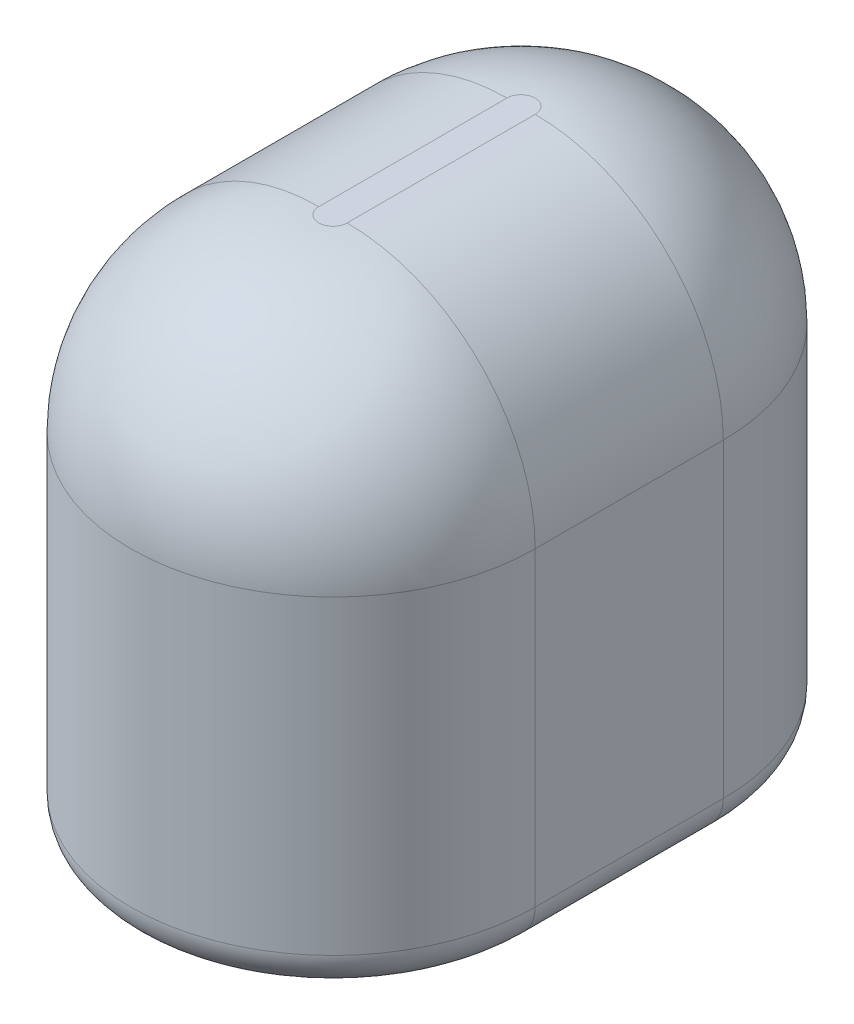
ISO-10303-21;
HEADER;
FILE_DESCRIPTION(('STEP AP214'),'2;1');
FILE_NAME('part.step','',(''),(''),'','','');
FILE_SCHEMA(('AUTOMOTIVE_DESIGN { 1 0 10303 214 1 1 1 1 }'));
ENDSEC;
DATA;
#1=APPLICATION_CONTEXT('core data for automotive mechanical design processes');
#2=APPLICATION_PROTOCOL_DEFINITION('international standard','automotive_design',2000,#1);
#3=PRODUCT_CONTEXT('',#1,'mechanical');
#4=PRODUCT('Part','Part','',(#3));
#5=PRODUCT_RELATED_PRODUCT_CATEGORY('part','',(#4));
#6=PRODUCT_DEFINITION_FORMATION('','',#4);
#7=PRODUCT_DEFINITION_CONTEXT('part definition',#1,'design');
#8=PRODUCT_DEFINITION('design','',#6,#7);
#9=PRODUCT_DEFINITION_SHAPE('','',#8);
#10=(LENGTH_UNIT() NAMED_UNIT(*) SI_UNIT(.MILLI.,.METRE.));
#11=(NAMED_UNIT(*) PLANE_ANGLE_UNIT() SI_UNIT($,.RADIAN.));
#12=(NAMED_UNIT(*) SI_UNIT($,.STERADIAN.) SOLID_ANGLE_UNIT());
#13=UNCERTAINTY_MEASURE_WITH_UNIT(LENGTH_MEASURE(1.E-05),#10,'distance_accuracy_value','');
#14=(GEOMETRIC_REPRESENTATION_CONTEXT(3) GLOBAL_UNCERTAINTY_ASSIGNED_CONTEXT((#13)) GLOBAL_UNIT_ASSIGNED_CONTEXT((#10,
#11,#12)) REPRESENTATION_CONTEXT('',''));
#15=CARTESIAN_POINT('',(0.,0.,0.));
#16=DIRECTION('',(0.,0.,1.));
#17=DIRECTION('',(1.,0.,0.));
#18=AXIS2_PLACEMENT_3D('',#15,#16,#17);
#19=CARTESIAN_POINT('',(0.,28.5,5.));
#20=DIRECTION('',(0.,-1.,0.));
#21=DIRECTION('',(0.,0.,-1.));
#22=AXIS2_PLACEMENT_3D('',#19,#20,#21);
#23=CYLINDRICAL_SURFACE('',#22,10.75);
#24=DIRECTION('',(0.,-1.,0.));
#25=VECTOR('',#24,1.);
#26=CARTESIAN_POINT('',(-10.75,28.5,5.));
#27=LINE('',#26,#25);
#28=CARTESIAN_POINT('',(-10.75,18.5,5.));
#29=VERTEX_POINT('',#28);
#30=CARTESIAN_POINT('',(-10.75,2.00000000000001,5.));
#31=VERTEX_POINT('',#30);
#32=EDGE_CURVE('E209',#29,#31,#27,.T.);
#33=ORIENTED_EDGE('',*,*,#32,.T.);
#34=CARTESIAN_POINT('',(0.,2.,5.));
#35=DIRECTION('',(0.,1.,0.));
#36=DIRECTION('',(0.,0.,1.));
#37=AXIS2_PLACEMENT_3D('',#34,#35,#36);
#38=CIRCLE('',#37,10.75);
#39=CARTESIAN_POINT('',(10.75,2.00000000000001,5.));
#40=VERTEX_POINT('',#39);
#41=EDGE_CURVE('E112',#31,#40,#38,.T.);
#42=ORIENTED_EDGE('',*,*,#41,.T.);
#43=DIRECTION('',(0.,-1.,0.));
#44=VECTOR('',#43,1.);
#45=CARTESIAN_POINT('',(10.75,28.5,5.));
#46=LINE('',#45,#44);
#47=CARTESIAN_POINT('',(10.75,18.5,5.));
#48=VERTEX_POINT('',#47);
#49=EDGE_CURVE('E186',#48,#40,#46,.T.);
#50=ORIENTED_EDGE('',*,*,#49,.F.);
#51=CARTESIAN_POINT('',(0.,18.5,5.));
#52=DIRECTION('',(0.,1.,0.));
#53=DIRECTION('',(0.,0.,1.));
#54=AXIS2_PLACEMENT_3D('',#51,#52,#53);
#55=CIRCLE('',#54,10.75);
#56=EDGE_CURVE('E201',#48,#29,#55,.F.);
#57=ORIENTED_EDGE('',*,*,#56,.T.);
#58=EDGE_LOOP('',(#33,#42,#50,#57));
#59=FACE_BOUND('',#58,.T.);
#60=ADVANCED_FACE('F34',(#59),#23,.T.);
#61=CARTESIAN_POINT('',(10.75,28.5,5.));
#62=DIRECTION('',(-1.,0.,0.));
#63=DIRECTION('',(0.,0.,1.));
#64=AXIS2_PLACEMENT_3D('',#61,#62,#63);
#65=PLANE('',#64);
#66=ORIENTED_EDGE('',*,*,#49,.T.);
#67=DIRECTION('',(0.,0.,-1.));
#68=VECTOR('',#67,1.);
#69=CARTESIAN_POINT('',(10.75,2.,5.));
#70=LINE('',#69,#68);
#71=CARTESIAN_POINT('',(10.75,2.00000000000001,-5.00000000000001));
#72=VERTEX_POINT('',#71);
#73=EDGE_CURVE('E119',#40,#72,#70,.T.);
#74=ORIENTED_EDGE('',*,*,#73,.T.);
#75=DIRECTION('',(0.,-1.,0.));
#76=VECTOR('',#75,1.);
#77=CARTESIAN_POINT('',(10.75,28.5,-5.00000000000001));
#78=LINE('',#77,#76);
#79=CARTESIAN_POINT('',(10.75,18.5,-5.00000000000001));
#80=VERTEX_POINT('',#79);
#81=EDGE_CURVE('E672',#80,#72,#78,.T.);
#82=ORIENTED_EDGE('',*,*,#81,.F.);
#83=DIRECTION('',(0.,0.,-1.));
#84=VECTOR('',#83,1.);
#85=CARTESIAN_POINT('',(10.75,18.5,5.));
#86=LINE('',#85,#84);
#87=EDGE_CURVE('E199',#80,#48,#86,.F.);
#88=ORIENTED_EDGE('',*,*,#87,.T.);
#89=EDGE_LOOP('',(#66,#74,#82,#88));
#90=FACE_BOUND('',#89,.T.);
#91=ADVANCED_FACE('F634',(#90),#65,.F.);
#92=CARTESIAN_POINT('',(0.,28.5,-5.));
#93=DIRECTION('',(0.,-1.,0.));
#94=DIRECTION('',(0.,0.,-1.));
#95=AXIS2_PLACEMENT_3D('',#92,#93,#94);
#96=CYLINDRICAL_SURFACE('',#95,10.75);
#97=ORIENTED_EDGE('',*,*,#81,.T.);
#98=CARTESIAN_POINT('',(0.,2.,-5.));
#99=DIRECTION('',(0.,1.,0.));
#100=DIRECTION('',(0.,0.,1.));
#101=AXIS2_PLACEMENT_3D('',#98,#99,#100);
#102=CIRCLE('',#101,10.75);
#103=CARTESIAN_POINT('',(-10.75,2.00000000000001,-5.));
#104=VERTEX_POINT('',#103);
#105=EDGE_CURVE('E221',#72,#104,#102,.T.);
#106=ORIENTED_EDGE('',*,*,#105,.T.);
#107=DIRECTION('',(0.,-1.,0.));
#108=VECTOR('',#107,1.);
#109=CARTESIAN_POINT('',(-10.75,28.5,-5.));
#110=LINE('',#109,#108);
#111=CARTESIAN_POINT('',(-10.75,18.5,-5.));
#112=VERTEX_POINT('',#111);
#113=EDGE_CURVE('E669',#112,#104,#110,.T.);
#114=ORIENTED_EDGE('',*,*,#113,.F.);
#115=CARTESIAN_POINT('',(0.,18.5,-5.));
#116=DIRECTION('',(0.,1.,0.));
#117=DIRECTION('',(0.,0.,1.));
#118=AXIS2_PLACEMENT_3D('',#115,#116,#117);
#119=CIRCLE('',#118,10.75);
#120=EDGE_CURVE('E193',#112,#80,#119,.F.);
#121=ORIENTED_EDGE('',*,*,#120,.T.);
#122=EDGE_LOOP('',(#97,#106,#114,#121));
#123=FACE_BOUND('',#122,.T.);
#124=ADVANCED_FACE('F625',(#123),#96,.T.);
#125=CARTESIAN_POINT('',(-10.75,28.5,5.));
#126=DIRECTION('',(1.,0.,0.));
#127=DIRECTION('',(0.,0.,-1.));
#128=AXIS2_PLACEMENT_3D('',#125,#126,#127);
#129=PLANE('',#128);
#130=ORIENTED_EDGE('',*,*,#113,.T.);
#131=DIRECTION('',(0.,0.,1.));
#132=VECTOR('',#131,1.);
#133=CARTESIAN_POINT('',(-10.75,2.,5.));
#134=LINE('',#133,#132);
#135=EDGE_CURVE('E202',#104,#31,#134,.T.);
#136=ORIENTED_EDGE('',*,*,#135,.T.);
#137=ORIENTED_EDGE('',*,*,#32,.F.);
#138=DIRECTION('',(0.,0.,1.));
#139=VECTOR('',#138,1.);
#140=CARTESIAN_POINT('',(-10.75,18.5,-5.));
#141=LINE('',#140,#139);
#142=EDGE_CURVE('E172',#29,#112,#141,.F.);
#143=ORIENTED_EDGE('',*,*,#142,.T.);
#144=EDGE_LOOP('',(#130,#136,#137,#143));
#145=FACE_BOUND('',#144,.T.);
#146=ADVANCED_FACE('F618',(#145),#129,.F.);
#147=CARTESIAN_POINT('',(0.,28.5,5.));
#148=DIRECTION('',(0.,1.,0.));
#149=DIRECTION('',(0.,0.,1.));
#150=AXIS2_PLACEMENT_3D('',#147,#148,#149);
#151=PLANE('',#150);
#152=CARTESIAN_POINT('',(0.,28.5,-5.));
#153=DIRECTION('',(0.,1.,0.));
#154=DIRECTION('',(0.,0.,1.));
#155=AXIS2_PLACEMENT_3D('',#152,#153,#154);
#156=CIRCLE('',#155,0.749999999999997);
#157=CARTESIAN_POINT('',(0.749999999999997,28.5,-5.));
#158=VERTEX_POINT('',#157);
#159=CARTESIAN_POINT('',(-0.749999999999998,28.5,-5.));
#160=VERTEX_POINT('',#159);
#161=EDGE_CURVE('E190',#158,#160,#156,.T.);
#162=ORIENTED_EDGE('',*,*,#161,.T.);
#163=DIRECTION('',(0.,0.,1.));
#164=VECTOR('',#163,1.);
#165=CARTESIAN_POINT('',(-0.749999999999999,28.5,5.));
#166=LINE('',#165,#164);
#167=CARTESIAN_POINT('',(-0.749999999999996,28.5,5.));
#168=VERTEX_POINT('',#167);
#169=EDGE_CURVE('E170',#160,#168,#166,.T.);
#170=ORIENTED_EDGE('',*,*,#169,.T.);
#171=CARTESIAN_POINT('',(0.,28.5,5.));
#172=DIRECTION('',(0.,1.,0.));
#173=DIRECTION('',(0.,0.,1.));
#174=AXIS2_PLACEMENT_3D('',#171,#172,#173);
#175=CIRCLE('',#174,0.749999999999997);
#176=CARTESIAN_POINT('',(0.749999999999998,28.5,5.));
#177=VERTEX_POINT('',#176);
#178=EDGE_CURVE('E179',#168,#177,#175,.T.);
#179=ORIENTED_EDGE('',*,*,#178,.T.);
#180=DIRECTION('',(0.,0.,-1.));
#181=VECTOR('',#180,1.);
#182=CARTESIAN_POINT('',(0.749999999999997,28.5,-5.));
#183=LINE('',#182,#181);
#184=EDGE_CURVE('E185',#177,#158,#183,.T.);
#185=ORIENTED_EDGE('',*,*,#184,.T.);
#186=EDGE_LOOP('',(#162,#170,#179,#185));
#187=FACE_BOUND('',#186,.T.);
#188=ADVANCED_FACE('F188',(#187),#151,.T.);
#189=CARTESIAN_POINT('',(0.,0.,5.));
#190=DIRECTION('',(0.,1.,0.));
#191=DIRECTION('',(0.,0.,1.));
#192=AXIS2_PLACEMENT_3D('',#189,#190,#191);
#193=PLANE('',#192);
#194=CARTESIAN_POINT('',(0.,0.,0.));
#195=DIRECTION('',(0.,1.,0.));
#196=DIRECTION('',(0.,0.,1.));
#197=AXIS2_PLACEMENT_3D('',#194,#195,#196);
#198=CIRCLE('',#197,2.25);
#199=CARTESIAN_POINT('',(0.,0.,2.25));
#200=VERTEX_POINT('',#199);
#201=EDGE_CURVE('E243',#200,#200,#198,.T.);
#202=ORIENTED_EDGE('',*,*,#201,.T.);
#203=EDGE_LOOP('',(#202));
#204=FACE_BOUND('',#203,.T.);
#205=CARTESIAN_POINT('',(0.,0.,5.));
#206=DIRECTION('',(0.,1.,0.));
#207=DIRECTION('',(0.,0.,1.));
#208=AXIS2_PLACEMENT_3D('',#205,#206,#207);
#209=CIRCLE('',#208,8.75);
#210=CARTESIAN_POINT('',(8.75,0.,5.));
#211=VERTEX_POINT('',#210);
#212=CARTESIAN_POINT('',(-8.75,0.,5.));
#213=VERTEX_POINT('',#212);
#214=EDGE_CURVE('E212',#211,#213,#209,.F.);
#215=ORIENTED_EDGE('',*,*,#214,.T.);
#216=DIRECTION('',(0.,0.,1.));
#217=VECTOR('',#216,1.);
#218=CARTESIAN_POINT('',(-8.75,0.,5.));
#219=LINE('',#218,#217);
#220=CARTESIAN_POINT('',(-8.75,0.,-5.));
#221=VERTEX_POINT('',#220);
#222=EDGE_CURVE('E218',#213,#221,#219,.F.);
#223=ORIENTED_EDGE('',*,*,#222,.T.);
#224=CARTESIAN_POINT('',(0.,0.,-5.));
#225=DIRECTION('',(0.,1.,0.));
#226=DIRECTION('',(0.,0.,1.));
#227=AXIS2_PLACEMENT_3D('',#224,#225,#226);
#228=CIRCLE('',#227,8.75);
#229=CARTESIAN_POINT('',(8.75,0.,-5.));
#230=VERTEX_POINT('',#229);
#231=EDGE_CURVE('E216',#221,#230,#228,.F.);
#232=ORIENTED_EDGE('',*,*,#231,.T.);
#233=DIRECTION('',(0.,0.,-1.));
#234=VECTOR('',#233,1.);
#235=CARTESIAN_POINT('',(8.75,0.,5.));
#236=LINE('',#235,#234);
#237=EDGE_CURVE('E214',#230,#211,#236,.F.);
#238=ORIENTED_EDGE('',*,*,#237,.T.);
#239=EDGE_LOOP('',(#215,#223,#232,#238));
#240=FACE_BOUND('',#239,.T.);
#241=ADVANCED_FACE('F602',(#204,#240),#193,.F.);
#242=CARTESIAN_POINT('',(0.749999999999999,18.5,5.));
#243=DIRECTION('',(0.,0.,1.));
#244=DIRECTION('',(1.,0.,0.));
#245=AXIS2_PLACEMENT_3D('',#242,#243,#244);
#246=CYLINDRICAL_SURFACE('',#245,10.);
#247=CARTESIAN_POINT('',(0.749999999999997,18.5,5.));
#248=DIRECTION('',(0.,0.,1.));
#249=DIRECTION('',(1.,0.,0.));
#250=AXIS2_PLACEMENT_3D('',#247,#248,#249);
#251=CIRCLE('',#250,10.);
#252=EDGE_CURVE('E182',#48,#177,#251,.T.);
#253=ORIENTED_EDGE('',*,*,#252,.F.);
#254=ORIENTED_EDGE('',*,*,#87,.F.);
#255=CARTESIAN_POINT('',(0.749999999999997,18.5,-5.));
#256=DIRECTION('',(0.,0.,-1.));
#257=DIRECTION('',(-1.,0.,0.));
#258=AXIS2_PLACEMENT_3D('',#255,#256,#257);
#259=CIRCLE('',#258,10.);
#260=EDGE_CURVE('E206',#158,#80,#259,.T.);
#261=ORIENTED_EDGE('',*,*,#260,.F.);
#262=ORIENTED_EDGE('',*,*,#184,.F.);
#263=EDGE_LOOP('',(#253,#254,#261,#262));
#264=FACE_BOUND('',#263,.T.);
#265=ADVANCED_FACE('F593',(#264),#246,.T.);
#266=CARTESIAN_POINT('',(0.,18.5,-5.));
#267=DIRECTION('',(0.,1.,0.));
#268=DIRECTION('',(0.,0.,1.));
#269=AXIS2_PLACEMENT_3D('',#266,#267,#268);
#270=DEGENERATE_TOROIDAL_SURFACE('',#269,0.749999999999997,10.,.T.);
#271=ORIENTED_EDGE('',*,*,#260,.T.);
#272=ORIENTED_EDGE('',*,*,#120,.F.);
#273=CARTESIAN_POINT('',(-0.749999999999998,18.5,-5.));
#274=DIRECTION('',(0.,0.,1.));
#275=DIRECTION('',(1.,0.,0.));
#276=AXIS2_PLACEMENT_3D('',#273,#274,#275);
#277=CIRCLE('',#276,10.);
#278=EDGE_CURVE('E175',#160,#112,#277,.T.);
#279=ORIENTED_EDGE('',*,*,#278,.F.);
#280=ORIENTED_EDGE('',*,*,#161,.F.);
#281=EDGE_LOOP('',(#271,#272,#279,#280));
#282=FACE_BOUND('',#281,.T.);
#283=ADVANCED_FACE('F585',(#282),#270,.T.);
#284=CARTESIAN_POINT('',(0.,18.5,5.));
#285=DIRECTION('',(0.,1.,0.));
#286=DIRECTION('',(0.,0.,1.));
#287=AXIS2_PLACEMENT_3D('',#284,#285,#286);
#288=DEGENERATE_TOROIDAL_SURFACE('',#287,0.749999999999997,10.,.T.);
#289=ORIENTED_EDGE('',*,*,#252,.T.);
#290=ORIENTED_EDGE('',*,*,#178,.F.);
#291=CARTESIAN_POINT('',(-0.749999999999995,18.5,5.));
#292=DIRECTION('',(0.,0.,-1.));
#293=DIRECTION('',(-1.,0.,0.));
#294=AXIS2_PLACEMENT_3D('',#291,#292,#293);
#295=CIRCLE('',#294,10.);
#296=EDGE_CURVE('E166',#29,#168,#295,.T.);
#297=ORIENTED_EDGE('',*,*,#296,.F.);
#298=ORIENTED_EDGE('',*,*,#56,.F.);
#299=EDGE_LOOP('',(#289,#290,#297,#298));
#300=FACE_BOUND('',#299,.T.);
#301=ADVANCED_FACE('F180',(#300),#288,.T.);
#302=CARTESIAN_POINT('',(-0.749999999999999,18.5,5.));
#303=DIRECTION('',(0.,0.,-1.));
#304=DIRECTION('',(-1.,0.,0.));
#305=AXIS2_PLACEMENT_3D('',#302,#303,#304);
#306=CYLINDRICAL_SURFACE('',#305,10.);
#307=ORIENTED_EDGE('',*,*,#278,.T.);
#308=ORIENTED_EDGE('',*,*,#142,.F.);
#309=ORIENTED_EDGE('',*,*,#296,.T.);
#310=ORIENTED_EDGE('',*,*,#169,.F.);
#311=EDGE_LOOP('',(#307,#308,#309,#310));
#312=FACE_BOUND('',#311,.T.);
#313=ADVANCED_FACE('F168',(#312),#306,.T.);
#314=CARTESIAN_POINT('',(8.75,2.,5.));
#315=DIRECTION('',(0.,0.,-1.));
#316=DIRECTION('',(-1.,0.,0.));
#317=AXIS2_PLACEMENT_3D('',#314,#315,#316);
#318=CYLINDRICAL_SURFACE('',#317,2.);
#319=CARTESIAN_POINT('',(8.75,2.,5.));
#320=DIRECTION('',(0.,0.,1.));
#321=DIRECTION('',(1.,0.,0.));
#322=AXIS2_PLACEMENT_3D('',#319,#320,#321);
#323=CIRCLE('',#322,2.);
#324=EDGE_CURVE('E230',#211,#40,#323,.T.);
#325=ORIENTED_EDGE('',*,*,#324,.F.);
#326=ORIENTED_EDGE('',*,*,#237,.F.);
#327=CARTESIAN_POINT('',(8.75,2.,-5.00000000000001));
#328=DIRECTION('',(0.,0.,-1.));
#329=DIRECTION('',(0.,1.,0.));
#330=AXIS2_PLACEMENT_3D('',#327,#328,#329);
#331=CIRCLE('',#330,2.);
#332=EDGE_CURVE('E176',#72,#230,#331,.T.);
#333=ORIENTED_EDGE('',*,*,#332,.F.);
#334=ORIENTED_EDGE('',*,*,#73,.F.);
#335=EDGE_LOOP('',(#325,#326,#333,#334));
#336=FACE_BOUND('',#335,.T.);
#337=ADVANCED_FACE('F559',(#336),#318,.T.);
#338=CARTESIAN_POINT('',(0.,2.,-5.));
#339=DIRECTION('',(0.,1.,0.));
#340=DIRECTION('',(0.,0.,1.));
#341=AXIS2_PLACEMENT_3D('',#338,#339,#340);
#342=TOROIDAL_SURFACE('',#341,8.75,2.);
#343=ORIENTED_EDGE('',*,*,#332,.T.);
#344=ORIENTED_EDGE('',*,*,#231,.F.);
#345=CARTESIAN_POINT('',(-8.75,2.,-5.));
#346=DIRECTION('',(0.,0.,1.));
#347=DIRECTION('',(1.,0.,0.));
#348=AXIS2_PLACEMENT_3D('',#345,#346,#347);
#349=CIRCLE('',#348,2.);
#350=EDGE_CURVE('E228',#104,#221,#349,.T.);
#351=ORIENTED_EDGE('',*,*,#350,.F.);
#352=ORIENTED_EDGE('',*,*,#105,.F.);
#353=EDGE_LOOP('',(#343,#344,#351,#352));
#354=FACE_BOUND('',#353,.T.);
#355=ADVANCED_FACE('F550',(#354),#342,.T.);
#356=CARTESIAN_POINT('',(0.,2.,5.));
#357=DIRECTION('',(0.,1.,0.));
#358=DIRECTION('',(0.,0.,1.));
#359=AXIS2_PLACEMENT_3D('',#356,#357,#358);
#360=TOROIDAL_SURFACE('',#359,8.75,2.);
#361=ORIENTED_EDGE('',*,*,#324,.T.);
#362=ORIENTED_EDGE('',*,*,#41,.F.);
#363=CARTESIAN_POINT('',(-8.75,2.,5.));
#364=DIRECTION('',(0.,0.,-1.));
#365=DIRECTION('',(-1.,0.,0.));
#366=AXIS2_PLACEMENT_3D('',#363,#364,#365);
#367=CIRCLE('',#366,2.);
#368=EDGE_CURVE('E226',#213,#31,#367,.T.);
#369=ORIENTED_EDGE('',*,*,#368,.F.);
#370=ORIENTED_EDGE('',*,*,#214,.F.);
#371=EDGE_LOOP('',(#361,#362,#369,#370));
#372=FACE_BOUND('',#371,.T.);
#373=ADVANCED_FACE('F541',(#372),#360,.T.);
#374=CARTESIAN_POINT('',(-8.75,2.,5.));
#375=DIRECTION('',(0.,0.,1.));
#376=DIRECTION('',(1.,0.,0.));
#377=AXIS2_PLACEMENT_3D('',#374,#375,#376);
#378=CYLINDRICAL_SURFACE('',#377,2.);
#379=ORIENTED_EDGE('',*,*,#350,.T.);
#380=ORIENTED_EDGE('',*,*,#222,.F.);
#381=ORIENTED_EDGE('',*,*,#368,.T.);
#382=ORIENTED_EDGE('',*,*,#135,.F.);
#383=EDGE_LOOP('',(#379,#380,#381,#382));
#384=FACE_BOUND('',#383,.T.);
#385=ADVANCED_FACE('F533',(#384),#378,.T.);
#386=CARTESIAN_POINT('',(0.,-7.,0.));
#387=DIRECTION('',(0.,1.,0.));
#388=DIRECTION('',(0.,0.,1.));
#389=AXIS2_PLACEMENT_3D('',#386,#387,#388);
#390=CYLINDRICAL_SURFACE('',#389,1.75);
#391=CARTESIAN_POINT('',(0.,-0.5,0.));
#392=DIRECTION('',(0.,1.,0.));
#393=DIRECTION('',(0.,0.,1.));
#394=AXIS2_PLACEMENT_3D('',#391,#392,#393);
#395=CIRCLE('',#394,1.75);
#396=CARTESIAN_POINT('',(0.,-0.5,1.75));
#397=VERTEX_POINT('',#396);
#398=EDGE_CURVE('E240',#397,#397,#395,.F.);
#399=ORIENTED_EDGE('',*,*,#398,.T.);
#400=EDGE_LOOP('',(#399));
#401=FACE_BOUND('',#400,.T.);
#402=CARTESIAN_POINT('',(0.,-6.,0.));
#403=DIRECTION('',(0.,-1.,0.));
#404=DIRECTION('',(0.,0.,-1.));
#405=AXIS2_PLACEMENT_3D('',#402,#403,#404);
#406=CIRCLE('',#405,1.75);
#407=CARTESIAN_POINT('',(0.,-6.,-1.75));
#408=VERTEX_POINT('',#407);
#409=EDGE_CURVE('E237',#408,#408,#406,.F.);
#410=ORIENTED_EDGE('',*,*,#409,.T.);
#411=EDGE_LOOP('',(#410));
#412=FACE_BOUND('',#411,.T.);
#413=ADVANCED_FACE('F524',(#401,#412),#390,.T.);
#414=CARTESIAN_POINT('',(0.,-7.,0.));
#415=DIRECTION('',(0.,-1.,0.));
#416=DIRECTION('',(0.,0.,-1.));
#417=AXIS2_PLACEMENT_3D('',#414,#415,#416);
#418=PLANE('',#417);
#419=CARTESIAN_POINT('',(0.,-7.,0.));
#420=DIRECTION('',(0.,-1.,0.));
#421=DIRECTION('',(0.,0.,-1.));
#422=AXIS2_PLACEMENT_3D('',#419,#420,#421);
#423=CIRCLE('',#422,0.75);
#424=CARTESIAN_POINT('',(0.,-7.,-0.75));
#425=VERTEX_POINT('',#424);
#426=EDGE_CURVE('E225',#425,#425,#423,.T.);
#427=ORIENTED_EDGE('',*,*,#426,.T.);
#428=EDGE_LOOP('',(#427));
#429=FACE_BOUND('',#428,.T.);
#430=ADVANCED_FACE('F515',(#429),#418,.T.);
#431=CARTESIAN_POINT('',(0.,-6.,0.));
#432=DIRECTION('',(0.,-1.,0.));
#433=DIRECTION('',(0.,0.,-1.));
#434=AXIS2_PLACEMENT_3D('',#431,#432,#433);
#435=DEGENERATE_TOROIDAL_SURFACE('',#434,0.75,1.,.T.);
#436=ORIENTED_EDGE('',*,*,#409,.F.);
#437=EDGE_LOOP('',(#436));
#438=FACE_BOUND('',#437,.T.);
#439=ORIENTED_EDGE('',*,*,#426,.F.);
#440=EDGE_LOOP('',(#439));
#441=FACE_BOUND('',#440,.T.);
#442=ADVANCED_FACE('F506',(#438,#441),#435,.T.);
#443=CARTESIAN_POINT('',(0.,-0.5,0.));
#444=DIRECTION('',(0.,1.,0.));
#445=DIRECTION('',(0.,0.,1.));
#446=AXIS2_PLACEMENT_3D('',#443,#444,#445);
#447=TOROIDAL_SURFACE('',#446,2.25,0.5);
#448=ORIENTED_EDGE('',*,*,#201,.F.);
#449=EDGE_LOOP('',(#448));
#450=FACE_BOUND('',#449,.T.);
#451=ORIENTED_EDGE('',*,*,#398,.F.);
#452=EDGE_LOOP('',(#451));
#453=FACE_BOUND('',#452,.T.);
#454=ADVANCED_FACE('F376',(#450,#453),#447,.F.);
#455=CLOSED_SHELL('',(#60,#91,#124,#146,#188,#241,#265,#283,#301,#313,#337,#355,#373,#385,#413,
#430,#442,#454));
#456=CARTESIAN_POINT('',(0.,28.5,5.));
#457=DIRECTION('',(0.,-1.,0.));
#458=DIRECTION('',(0.,0.,-1.));
#459=AXIS2_PLACEMENT_3D('',#456,#457,#458);
#460=CYLINDRICAL_SURFACE('',#459,9.75);
#461=DIRECTION('',(0.,-1.,0.));
#462=VECTOR('',#461,1.);
#463=CARTESIAN_POINT('',(-9.74999999999999,28.5,5.));
#464=LINE('',#463,#462);
#465=CARTESIAN_POINT('',(-9.74999999999999,18.5,5.));
#466=VERTEX_POINT('',#465);
#467=CARTESIAN_POINT('',(-9.75,2.,5.));
#468=VERTEX_POINT('',#467);
#469=EDGE_CURVE('E38',#466,#468,#464,.T.);
#470=ORIENTED_EDGE('',*,*,#469,.F.);
#471=CARTESIAN_POINT('',(0.,18.5,5.));
#472=DIRECTION('',(0.,-1.,0.));
#473=DIRECTION('',(0.,0.,-1.));
#474=AXIS2_PLACEMENT_3D('',#471,#472,#473);
#475=CIRCLE('',#474,9.75);
#476=CARTESIAN_POINT('',(9.75,18.5,5.));
#477=VERTEX_POINT('',#476);
#478=EDGE_CURVE('E101',#477,#466,#475,.T.);
#479=ORIENTED_EDGE('',*,*,#478,.F.);
#480=DIRECTION('',(0.,1.,0.));
#481=VECTOR('',#480,1.);
#482=CARTESIAN_POINT('',(9.75,28.5,5.));
#483=LINE('',#482,#481);
#484=CARTESIAN_POINT('',(9.75,2.00000000000001,5.));
#485=VERTEX_POINT('',#484);
#486=EDGE_CURVE('E308',#477,#485,#483,.F.);
#487=ORIENTED_EDGE('',*,*,#486,.T.);
#488=CARTESIAN_POINT('',(0.,2.00000000000001,5.));
#489=DIRECTION('',(0.,-1.,0.));
#490=DIRECTION('',(0.,0.,-1.));
#491=AXIS2_PLACEMENT_3D('',#488,#489,#490);
#492=CIRCLE('',#491,9.75);
#493=EDGE_CURVE('E104',#468,#485,#492,.F.);
#494=ORIENTED_EDGE('',*,*,#493,.F.);
#495=EDGE_LOOP('',(#470,#479,#487,#494));
#496=FACE_BOUND('',#495,.T.);
#497=ADVANCED_FACE('F318',(#496),#460,.F.);
#498=CARTESIAN_POINT('',(9.75,28.5,5.));
#499=DIRECTION('',(-1.,0.,0.));
#500=DIRECTION('',(0.,0.,1.));
#501=AXIS2_PLACEMENT_3D('',#498,#499,#500);
#502=PLANE('',#501);
#503=ORIENTED_EDGE('',*,*,#486,.F.);
#504=DIRECTION('',(0.,0.,1.));
#505=VECTOR('',#504,1.);
#506=CARTESIAN_POINT('',(9.75,18.5,5.));
#507=LINE('',#506,#505);
#508=CARTESIAN_POINT('',(9.74999999999999,18.5,-5.00000000000001));
#509=VERTEX_POINT('',#508);
#510=EDGE_CURVE('E304',#509,#477,#507,.T.);
#511=ORIENTED_EDGE('',*,*,#510,.F.);
#512=DIRECTION('',(0.,-1.,0.));
#513=VECTOR('',#512,1.);
#514=CARTESIAN_POINT('',(9.74999999999999,28.5,-5.00000000000001));
#515=LINE('',#514,#513);
#516=CARTESIAN_POINT('',(9.75,2.00000000000001,-5.00000000000001));
#517=VERTEX_POINT('',#516);
#518=EDGE_CURVE('E301',#509,#517,#515,.T.);
#519=ORIENTED_EDGE('',*,*,#518,.T.);
#520=DIRECTION('',(0.,0.,1.));
#521=VECTOR('',#520,1.);
#522=CARTESIAN_POINT('',(9.75,2.00000000000001,5.));
#523=LINE('',#522,#521);
#524=EDGE_CURVE('E306',#485,#517,#523,.F.);
#525=ORIENTED_EDGE('',*,*,#524,.F.);
#526=EDGE_LOOP('',(#503,#511,#519,#525));
#527=FACE_BOUND('',#526,.T.);
#528=ADVANCED_FACE('F356',(#527),#502,.T.);
#529=CARTESIAN_POINT('',(0.,28.5,-5.));
#530=DIRECTION('',(0.,-1.,0.));
#531=DIRECTION('',(0.,0.,-1.));
#532=AXIS2_PLACEMENT_3D('',#529,#530,#531);
#533=CYLINDRICAL_SURFACE('',#532,9.75);
#534=ORIENTED_EDGE('',*,*,#518,.F.);
#535=CARTESIAN_POINT('',(0.,18.5,-5.));
#536=DIRECTION('',(0.,-1.,0.));
#537=DIRECTION('',(0.,0.,-1.));
#538=AXIS2_PLACEMENT_3D('',#535,#536,#537);
#539=CIRCLE('',#538,9.75);
#540=CARTESIAN_POINT('',(-9.75,18.5,-5.));
#541=VERTEX_POINT('',#540);
#542=EDGE_CURVE('E297',#541,#509,#539,.T.);
#543=ORIENTED_EDGE('',*,*,#542,.F.);
#544=DIRECTION('',(0.,1.,0.));
#545=VECTOR('',#544,1.);
#546=CARTESIAN_POINT('',(-9.75,28.5,-5.));
#547=LINE('',#546,#545);
#548=CARTESIAN_POINT('',(-9.75,2.00000000000001,-5.));
#549=VERTEX_POINT('',#548);
#550=EDGE_CURVE('E294',#541,#549,#547,.F.);
#551=ORIENTED_EDGE('',*,*,#550,.T.);
#552=CARTESIAN_POINT('',(0.,2.00000000000001,-5.));
#553=DIRECTION('',(0.,-1.,0.));
#554=DIRECTION('',(0.,0.,-1.));
#555=AXIS2_PLACEMENT_3D('',#552,#553,#554);
#556=CIRCLE('',#555,9.75);
#557=EDGE_CURVE('E299',#517,#549,#556,.F.);
#558=ORIENTED_EDGE('',*,*,#557,.F.);
#559=EDGE_LOOP('',(#534,#543,#551,#558));
#560=FACE_BOUND('',#559,.T.);
#561=ADVANCED_FACE('F338',(#560),#533,.F.);
#562=CARTESIAN_POINT('',(-9.75,28.5,5.));
#563=DIRECTION('',(1.,0.,0.));
#564=DIRECTION('',(0.,0.,-1.));
#565=AXIS2_PLACEMENT_3D('',#562,#563,#564);
#566=PLANE('',#565);
#567=ORIENTED_EDGE('',*,*,#550,.F.);
#568=DIRECTION('',(0.,0.,-1.));
#569=VECTOR('',#568,1.);
#570=CARTESIAN_POINT('',(-9.75,18.5,5.));
#571=LINE('',#570,#569);
#572=EDGE_CURVE('E288',#466,#541,#571,.T.);
#573=ORIENTED_EDGE('',*,*,#572,.F.);
#574=ORIENTED_EDGE('',*,*,#469,.T.);
#575=DIRECTION('',(0.,0.,-1.));
#576=VECTOR('',#575,1.);
#577=CARTESIAN_POINT('',(-9.75,2.00000000000001,5.));
#578=LINE('',#577,#576);
#579=EDGE_CURVE('E291',#549,#468,#578,.F.);
#580=ORIENTED_EDGE('',*,*,#579,.F.);
#581=EDGE_LOOP('',(#567,#573,#574,#580));
#582=FACE_BOUND('',#581,.T.);
#583=ADVANCED_FACE('F315',(#582),#566,.T.);
#584=CARTESIAN_POINT('',(0.,27.5,5.));
#585=DIRECTION('',(0.,1.,0.));
#586=DIRECTION('',(0.,0.,1.));
#587=AXIS2_PLACEMENT_3D('',#584,#585,#586);
#588=PLANE('',#587);
#589=CARTESIAN_POINT('',(0.,27.5,-5.));
#590=DIRECTION('',(0.,1.,0.));
#591=DIRECTION('',(0.,0.,1.));
#592=AXIS2_PLACEMENT_3D('',#589,#590,#591);
#593=CIRCLE('',#592,0.749999999999998);
#594=CARTESIAN_POINT('',(0.749999999999997,27.5,-5.));
#595=VERTEX_POINT('',#594);
#596=CARTESIAN_POINT('',(-0.749999999999998,27.5,-5.));
#597=VERTEX_POINT('',#596);
#598=EDGE_CURVE('E286',#595,#597,#593,.T.);
#599=ORIENTED_EDGE('',*,*,#598,.F.);
#600=DIRECTION('',(0.,0.,1.));
#601=VECTOR('',#600,1.);
#602=CARTESIAN_POINT('',(0.749999999999998,27.5,5.));
#603=LINE('',#602,#601);
#604=CARTESIAN_POINT('',(0.749999999999998,27.5,5.));
#605=VERTEX_POINT('',#604);
#606=EDGE_CURVE('E279',#605,#595,#603,.F.);
#607=ORIENTED_EDGE('',*,*,#606,.F.);
#608=CARTESIAN_POINT('',(0.,27.5,5.));
#609=DIRECTION('',(0.,1.,0.));
#610=DIRECTION('',(0.,0.,1.));
#611=AXIS2_PLACEMENT_3D('',#608,#609,#610);
#612=CIRCLE('',#611,0.749999999999998);
#613=CARTESIAN_POINT('',(-0.749999999999998,27.5,5.));
#614=VERTEX_POINT('',#613);
#615=EDGE_CURVE('E281',#614,#605,#612,.T.);
#616=ORIENTED_EDGE('',*,*,#615,.F.);
#617=DIRECTION('',(0.,0.,1.));
#618=VECTOR('',#617,1.);
#619=CARTESIAN_POINT('',(-0.749999999999998,27.5,5.));
#620=LINE('',#619,#618);
#621=EDGE_CURVE('E283',#597,#614,#620,.T.);
#622=ORIENTED_EDGE('',*,*,#621,.F.);
#623=EDGE_LOOP('',(#599,#607,#616,#622));
#624=FACE_BOUND('',#623,.T.);
#625=ADVANCED_FACE('F352',(#624),#588,.F.);
#626=CARTESIAN_POINT('',(0.,1.,5.));
#627=DIRECTION('',(0.,1.,0.));
#628=DIRECTION('',(0.,0.,1.));
#629=AXIS2_PLACEMENT_3D('',#626,#627,#628);
#630=PLANE('',#629);
#631=CARTESIAN_POINT('',(0.,1.,0.));
#632=DIRECTION('',(0.,1.,0.));
#633=DIRECTION('',(0.,0.,1.));
#634=AXIS2_PLACEMENT_3D('',#631,#632,#633);
#635=CIRCLE('',#634,2.25);
#636=CARTESIAN_POINT('',(0.,1.,2.25));
#637=VERTEX_POINT('',#636);
#638=EDGE_CURVE('E276',#637,#637,#635,.T.);
#639=ORIENTED_EDGE('',*,*,#638,.F.);
#640=EDGE_LOOP('',(#639));
#641=FACE_BOUND('',#640,.T.);
#642=CARTESIAN_POINT('',(0.,0.999999999999998,5.));
#643=DIRECTION('',(0.,1.,0.));
#644=DIRECTION('',(0.,0.,1.));
#645=AXIS2_PLACEMENT_3D('',#642,#643,#644);
#646=CIRCLE('',#645,8.75);
#647=CARTESIAN_POINT('',(8.75,1.,5.));
#648=VERTEX_POINT('',#647);
#649=CARTESIAN_POINT('',(-8.75,1.,5.));
#650=VERTEX_POINT('',#649);
#651=EDGE_CURVE('E274',#648,#650,#646,.F.);
#652=ORIENTED_EDGE('',*,*,#651,.F.);
#653=DIRECTION('',(0.,0.,1.));
#654=VECTOR('',#653,1.);
#655=CARTESIAN_POINT('',(8.75,1.,5.));
#656=LINE('',#655,#654);
#657=CARTESIAN_POINT('',(8.75,1.,-5.));
#658=VERTEX_POINT('',#657);
#659=EDGE_CURVE('E267',#658,#648,#656,.T.);
#660=ORIENTED_EDGE('',*,*,#659,.F.);
#661=CARTESIAN_POINT('',(0.,0.999999999999998,-5.));
#662=DIRECTION('',(0.,1.,0.));
#663=DIRECTION('',(0.,0.,1.));
#664=AXIS2_PLACEMENT_3D('',#661,#662,#663);
#665=CIRCLE('',#664,8.75);
#666=CARTESIAN_POINT('',(-8.75,0.999999999999998,-5.));
#667=VERTEX_POINT('',#666);
#668=EDGE_CURVE('E269',#667,#658,#665,.F.);
#669=ORIENTED_EDGE('',*,*,#668,.F.);
#670=DIRECTION('',(0.,0.,1.));
#671=VECTOR('',#670,1.);
#672=CARTESIAN_POINT('',(-8.75,1.,5.));
#673=LINE('',#672,#671);
#674=EDGE_CURVE('E271',#650,#667,#673,.F.);
#675=ORIENTED_EDGE('',*,*,#674,.F.);
#676=EDGE_LOOP('',(#652,#660,#669,#675));
#677=FACE_BOUND('',#676,.T.);
#678=ADVANCED_FACE('F333',(#641,#677),#630,.T.);
#679=CARTESIAN_POINT('',(0.749999999999999,18.5,5.));
#680=DIRECTION('',(0.,0.,1.));
#681=DIRECTION('',(1.,0.,0.));
#682=AXIS2_PLACEMENT_3D('',#679,#680,#681);
#683=CYLINDRICAL_SURFACE('',#682,9.);
#684=CARTESIAN_POINT('',(0.749999999999998,18.5,5.));
#685=DIRECTION('',(0.,0.,1.));
#686=DIRECTION('',(1.,0.,0.));
#687=AXIS2_PLACEMENT_3D('',#684,#685,#686);
#688=CIRCLE('',#687,9.);
#689=EDGE_CURVE('E261',#477,#605,#688,.T.);
#690=ORIENTED_EDGE('',*,*,#689,.T.);
#691=ORIENTED_EDGE('',*,*,#606,.T.);
#692=CARTESIAN_POINT('',(0.749999999999996,18.5,-5.));
#693=DIRECTION('',(0.,0.,1.));
#694=DIRECTION('',(1.,0.,0.));
#695=AXIS2_PLACEMENT_3D('',#692,#693,#694);
#696=CIRCLE('',#695,9.);
#697=EDGE_CURVE('E264',#595,#509,#696,.F.);
#698=ORIENTED_EDGE('',*,*,#697,.T.);
#699=ORIENTED_EDGE('',*,*,#510,.T.);
#700=EDGE_LOOP('',(#690,#691,#698,#699));
#701=FACE_BOUND('',#700,.T.);
#702=ADVANCED_FACE('F354',(#701),#683,.F.);
#703=CARTESIAN_POINT('',(0.,18.5,-5.));
#704=DIRECTION('',(0.,1.,0.));
#705=DIRECTION('',(0.,0.,1.));
#706=AXIS2_PLACEMENT_3D('',#703,#704,#705);
#707=DEGENERATE_TOROIDAL_SURFACE('',#706,0.749999999999997,9.,.T.);
#708=ORIENTED_EDGE('',*,*,#697,.F.);
#709=ORIENTED_EDGE('',*,*,#598,.T.);
#710=CARTESIAN_POINT('',(-0.750000000000001,18.5,-5.));
#711=DIRECTION('',(0.,0.,-1.));
#712=DIRECTION('',(-1.,0.,0.));
#713=AXIS2_PLACEMENT_3D('',#710,#711,#712);
#714=CIRCLE('',#713,9.);
#715=EDGE_CURVE('E259',#597,#541,#714,.F.);
#716=ORIENTED_EDGE('',*,*,#715,.T.);
#717=ORIENTED_EDGE('',*,*,#542,.T.);
#718=EDGE_LOOP('',(#708,#709,#716,#717));
#719=FACE_BOUND('',#718,.T.);
#720=ADVANCED_FACE('F390',(#719),#707,.F.);
#721=CARTESIAN_POINT('',(0.,18.5,5.));
#722=DIRECTION('',(0.,1.,0.));
#723=DIRECTION('',(0.,0.,1.));
#724=AXIS2_PLACEMENT_3D('',#721,#722,#723);
#725=DEGENERATE_TOROIDAL_SURFACE('',#724,0.749999999999997,9.,.T.);
#726=ORIENTED_EDGE('',*,*,#689,.F.);
#727=ORIENTED_EDGE('',*,*,#478,.T.);
#728=CARTESIAN_POINT('',(-0.749999999999999,18.5,5.));
#729=DIRECTION('',(0.,0.,-1.));
#730=DIRECTION('',(-1.,0.,0.));
#731=AXIS2_PLACEMENT_3D('',#728,#729,#730);
#732=CIRCLE('',#731,9.);
#733=EDGE_CURVE('E257',#466,#614,#732,.T.);
#734=ORIENTED_EDGE('',*,*,#733,.T.);
#735=ORIENTED_EDGE('',*,*,#615,.T.);
#736=EDGE_LOOP('',(#726,#727,#734,#735));
#737=FACE_BOUND('',#736,.T.);
#738=ADVANCED_FACE('F348',(#737),#725,.F.);
#739=CARTESIAN_POINT('',(-0.749999999999999,18.5,5.));
#740=DIRECTION('',(0.,0.,-1.));
#741=DIRECTION('',(-1.,0.,0.));
#742=AXIS2_PLACEMENT_3D('',#739,#740,#741);
#743=CYLINDRICAL_SURFACE('',#742,9.);
#744=ORIENTED_EDGE('',*,*,#715,.F.);
#745=ORIENTED_EDGE('',*,*,#621,.T.);
#746=ORIENTED_EDGE('',*,*,#733,.F.);
#747=ORIENTED_EDGE('',*,*,#572,.T.);
#748=EDGE_LOOP('',(#744,#745,#746,#747));
#749=FACE_BOUND('',#748,.T.);
#750=ADVANCED_FACE('F345',(#749),#743,.F.);
#751=CARTESIAN_POINT('',(8.75,2.,5.));
#752=DIRECTION('',(0.,0.,-1.));
#753=DIRECTION('',(-1.,0.,0.));
#754=AXIS2_PLACEMENT_3D('',#751,#752,#753);
#755=CYLINDRICAL_SURFACE('',#754,1.);
#756=CARTESIAN_POINT('',(8.75,2.,5.));
#757=DIRECTION('',(0.,0.,1.));
#758=DIRECTION('',(1.,0.,0.));
#759=AXIS2_PLACEMENT_3D('',#756,#757,#758);
#760=CIRCLE('',#759,1.);
#761=EDGE_CURVE('E251',#648,#485,#760,.T.);
#762=ORIENTED_EDGE('',*,*,#761,.T.);
#763=ORIENTED_EDGE('',*,*,#524,.T.);
#764=CARTESIAN_POINT('',(8.75,2.,-5.));
#765=DIRECTION('',(0.,0.,1.));
#766=DIRECTION('',(1.,0.,0.));
#767=AXIS2_PLACEMENT_3D('',#764,#765,#766);
#768=CIRCLE('',#767,1.);
#769=EDGE_CURVE('E254',#517,#658,#768,.F.);
#770=ORIENTED_EDGE('',*,*,#769,.T.);
#771=ORIENTED_EDGE('',*,*,#659,.T.);
#772=EDGE_LOOP('',(#762,#763,#770,#771));
#773=FACE_BOUND('',#772,.T.);
#774=ADVANCED_FACE('F335',(#773),#755,.F.);
#775=CARTESIAN_POINT('',(0.,2.,-5.));
#776=DIRECTION('',(0.,1.,0.));
#777=DIRECTION('',(0.,0.,1.));
#778=AXIS2_PLACEMENT_3D('',#775,#776,#777);
#779=TOROIDAL_SURFACE('',#778,8.75,1.);
#780=ORIENTED_EDGE('',*,*,#769,.F.);
#781=ORIENTED_EDGE('',*,*,#557,.T.);
#782=CARTESIAN_POINT('',(-8.75,2.,-5.));
#783=DIRECTION('',(0.,0.,1.));
#784=DIRECTION('',(1.,0.,0.));
#785=AXIS2_PLACEMENT_3D('',#782,#783,#784);
#786=CIRCLE('',#785,1.);
#787=EDGE_CURVE('E249',#549,#667,#786,.T.);
#788=ORIENTED_EDGE('',*,*,#787,.T.);
#789=ORIENTED_EDGE('',*,*,#668,.T.);
#790=EDGE_LOOP('',(#780,#781,#788,#789));
#791=FACE_BOUND('',#790,.T.);
#792=ADVANCED_FACE('F328',(#791),#779,.F.);
#793=CARTESIAN_POINT('',(0.,2.,5.));
#794=DIRECTION('',(0.,1.,0.));
#795=DIRECTION('',(0.,0.,1.));
#796=AXIS2_PLACEMENT_3D('',#793,#794,#795);
#797=TOROIDAL_SURFACE('',#796,8.75,1.);
#798=ORIENTED_EDGE('',*,*,#761,.F.);
#799=ORIENTED_EDGE('',*,*,#651,.T.);
#800=CARTESIAN_POINT('',(-8.75,2.,5.));
#801=DIRECTION('',(0.,0.,1.));
#802=DIRECTION('',(1.,0.,0.));
#803=AXIS2_PLACEMENT_3D('',#800,#801,#802);
#804=CIRCLE('',#803,1.);
#805=EDGE_CURVE('E54',#650,#468,#804,.F.);
#806=ORIENTED_EDGE('',*,*,#805,.T.);
#807=ORIENTED_EDGE('',*,*,#493,.T.);
#808=EDGE_LOOP('',(#798,#799,#806,#807));
#809=FACE_BOUND('',#808,.T.);
#810=ADVANCED_FACE('F357',(#809),#797,.F.);
#811=CARTESIAN_POINT('',(-8.75,2.,5.));
#812=DIRECTION('',(0.,0.,1.));
#813=DIRECTION('',(1.,0.,0.));
#814=AXIS2_PLACEMENT_3D('',#811,#812,#813);
#815=CYLINDRICAL_SURFACE('',#814,1.);
#816=ORIENTED_EDGE('',*,*,#787,.F.);
#817=ORIENTED_EDGE('',*,*,#579,.T.);
#818=ORIENTED_EDGE('',*,*,#805,.F.);
#819=ORIENTED_EDGE('',*,*,#674,.T.);
#820=EDGE_LOOP('',(#816,#817,#818,#819));
#821=FACE_BOUND('',#820,.T.);
#822=ADVANCED_FACE('F323',(#821),#815,.F.);
#823=CARTESIAN_POINT('',(0.,-7.,0.));
#824=DIRECTION('',(0.,1.,0.));
#825=DIRECTION('',(0.,0.,1.));
#826=AXIS2_PLACEMENT_3D('',#823,#824,#825);
#827=CYLINDRICAL_SURFACE('',#826,0.75);
#828=CARTESIAN_POINT('',(0.,-0.5,0.));
#829=DIRECTION('',(0.,1.,0.));
#830=DIRECTION('',(0.,0.,1.));
#831=AXIS2_PLACEMENT_3D('',#828,#829,#830);
#832=CIRCLE('',#831,0.75);
#833=CARTESIAN_POINT('',(0.,-0.5,0.75));
#834=VERTEX_POINT('',#833);
#835=EDGE_CURVE('E45',#834,#834,#832,.F.);
#836=ORIENTED_EDGE('',*,*,#835,.F.);
#837=EDGE_LOOP('',(#836));
#838=FACE_BOUND('',#837,.T.);
#839=CARTESIAN_POINT('',(0.,-6.,0.));
#840=DIRECTION('',(0.,-1.,0.));
#841=DIRECTION('',(0.,0.,-1.));
#842=AXIS2_PLACEMENT_3D('',#839,#840,#841);
#843=CIRCLE('',#842,0.75);
#844=CARTESIAN_POINT('',(0.,-6.,-0.75));
#845=VERTEX_POINT('',#844);
#846=EDGE_CURVE('E11',#845,#845,#843,.T.);
#847=ORIENTED_EDGE('',*,*,#846,.T.);
#848=EDGE_LOOP('',(#847));
#849=FACE_BOUND('',#848,.T.);
#850=ADVANCED_FACE('F365',(#838,#849),#827,.F.);
#851=CARTESIAN_POINT('',(0.,-6.,0.));
#852=DIRECTION('',(0.,-1.,0.));
#853=DIRECTION('',(0.,0.,-1.));
#854=AXIS2_PLACEMENT_3D('',#851,#852,#853);
#855=PLANE('',#854);
#856=ORIENTED_EDGE('',*,*,#846,.F.);
#857=EDGE_LOOP('',(#856));
#858=FACE_BOUND('',#857,.T.);
#859=ADVANCED_FACE('F425',(#858),#855,.F.);
#860=CARTESIAN_POINT('',(0.,-0.5,0.));
#861=DIRECTION('',(0.,1.,0.));
#862=DIRECTION('',(0.,0.,1.));
#863=AXIS2_PLACEMENT_3D('',#860,#861,#862);
#864=TOROIDAL_SURFACE('',#863,2.25,1.5);
#865=ORIENTED_EDGE('',*,*,#638,.T.);
#866=EDGE_LOOP('',(#865));
#867=FACE_BOUND('',#866,.T.);
#868=ORIENTED_EDGE('',*,*,#835,.T.);
#869=EDGE_LOOP('',(#868));
#870=FACE_BOUND('',#869,.T.);
#871=ADVANCED_FACE('F36',(#867,#870),#864,.T.);
#872=CLOSED_SHELL('',(#497,#528,#561,#583,#625,#678,#702,#720,#738,#750,#774,#792,#810,#822,
#850,#859,#871));
#873=ORIENTED_CLOSED_SHELL('',*,#872,.T.);
#874=BREP_WITH_VOIDS('B2',#455,(#873));
#875=ADVANCED_BREP_SHAPE_REPRESENTATION('',(#18,#874),#14);
#876=SHAPE_DEFINITION_REPRESENTATION(#9,#875);
ENDSEC;
END-ISO-10303-21;
